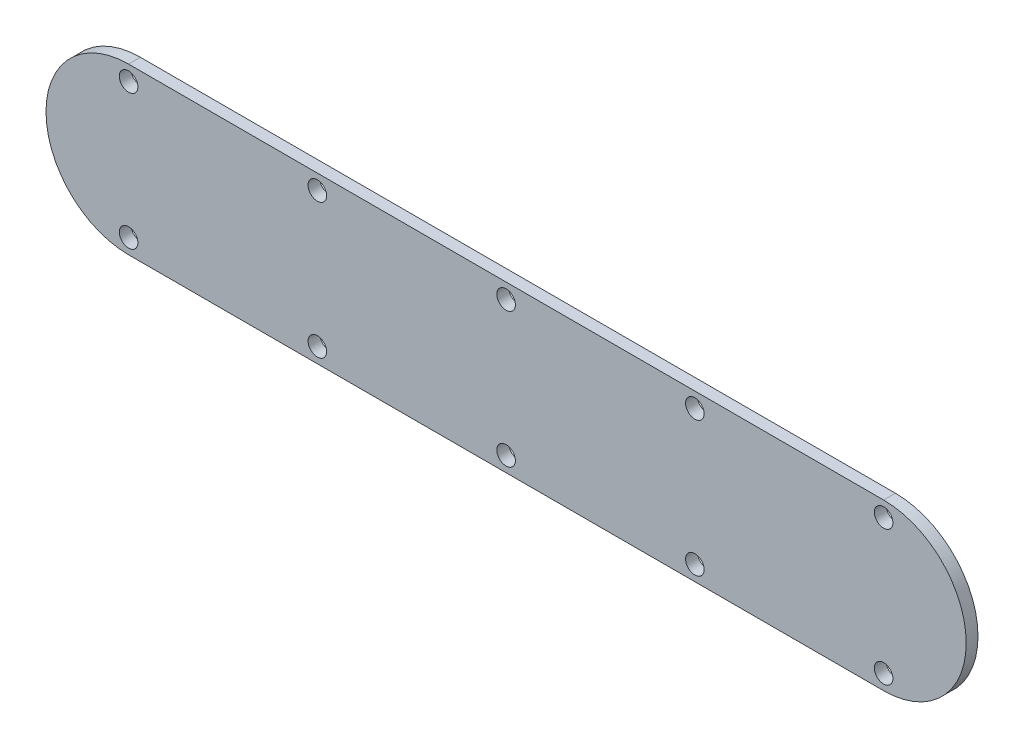
ISO-10303-21;
HEADER;
FILE_DESCRIPTION(('STEP AP214'),'2;1');
FILE_NAME('part.step','',(''),(''),'','','');
FILE_SCHEMA(('AUTOMOTIVE_DESIGN { 1 0 10303 214 1 1 1 1 }'));
ENDSEC;
DATA;
#1=APPLICATION_CONTEXT('core data for automotive mechanical design processes');
#2=APPLICATION_PROTOCOL_DEFINITION('international standard','automotive_design',2000,#1);
#3=PRODUCT_CONTEXT('',#1,'mechanical');
#4=PRODUCT('Part','Part','',(#3));
#5=PRODUCT_RELATED_PRODUCT_CATEGORY('part','',(#4));
#6=PRODUCT_DEFINITION_FORMATION('','',#4);
#7=PRODUCT_DEFINITION_CONTEXT('part definition',#1,'design');
#8=PRODUCT_DEFINITION('design','',#6,#7);
#9=PRODUCT_DEFINITION_SHAPE('','',#8);
#10=(LENGTH_UNIT() NAMED_UNIT(*) SI_UNIT(.MILLI.,.METRE.));
#11=(NAMED_UNIT(*) PLANE_ANGLE_UNIT() SI_UNIT($,.RADIAN.));
#12=(NAMED_UNIT(*) SI_UNIT($,.STERADIAN.) SOLID_ANGLE_UNIT());
#13=UNCERTAINTY_MEASURE_WITH_UNIT(LENGTH_MEASURE(1.E-05),#10,'distance_accuracy_value','');
#14=(GEOMETRIC_REPRESENTATION_CONTEXT(3) GLOBAL_UNCERTAINTY_ASSIGNED_CONTEXT((#13)) GLOBAL_UNIT_ASSIGNED_CONTEXT((#10,
#11,#12)) REPRESENTATION_CONTEXT('',''));
#15=CARTESIAN_POINT('',(0.,0.,0.));
#16=DIRECTION('',(0.,0.,1.));
#17=DIRECTION('',(1.,0.,0.));
#18=AXIS2_PLACEMENT_3D('',#15,#16,#17);
#19=CARTESIAN_POINT('',(0.,0.,3.175));
#20=DIRECTION('',(0.,0.,-1.));
#21=DIRECTION('',(-1.,0.,0.));
#22=AXIS2_PLACEMENT_3D('',#19,#20,#21);
#23=PLANE('',#22);
#24=CARTESIAN_POINT('',(-101.6,18.161,3.175));
#25=DIRECTION('',(0.,0.,1.));
#26=DIRECTION('',(1.,0.,0.));
#27=AXIS2_PLACEMENT_3D('',#24,#25,#26);
#28=CIRCLE('',#27,2.499999953);
#29=CARTESIAN_POINT('',(-99.100000047,18.161,3.175));
#30=VERTEX_POINT('',#29);
#31=EDGE_CURVE('E175',#30,#30,#28,.T.);
#32=ORIENTED_EDGE('',*,*,#31,.F.);
#33=EDGE_LOOP('',(#32));
#34=FACE_BOUND('',#33,.T.);
#35=CARTESIAN_POINT('',(-50.8,18.161,3.175));
#36=DIRECTION('',(0.,0.,1.));
#37=DIRECTION('',(1.,0.,0.));
#38=AXIS2_PLACEMENT_3D('',#35,#36,#37);
#39=CIRCLE('',#38,2.499999953);
#40=CARTESIAN_POINT('',(-48.300000047,18.161,3.175));
#41=VERTEX_POINT('',#40);
#42=EDGE_CURVE('E177',#41,#41,#39,.T.);
#43=ORIENTED_EDGE('',*,*,#42,.F.);
#44=EDGE_LOOP('',(#43));
#45=FACE_BOUND('',#44,.T.);
#46=CARTESIAN_POINT('',(0.,18.161,3.175));
#47=DIRECTION('',(0.,0.,1.));
#48=DIRECTION('',(1.,0.,0.));
#49=AXIS2_PLACEMENT_3D('',#46,#47,#48);
#50=CIRCLE('',#49,2.499999953);
#51=CARTESIAN_POINT('',(2.499999953,18.161,3.175));
#52=VERTEX_POINT('',#51);
#53=EDGE_CURVE('E185',#52,#52,#50,.T.);
#54=ORIENTED_EDGE('',*,*,#53,.F.);
#55=EDGE_LOOP('',(#54));
#56=FACE_BOUND('',#55,.T.);
#57=CARTESIAN_POINT('',(50.8,18.161,3.175));
#58=DIRECTION('',(0.,0.,1.));
#59=DIRECTION('',(1.,0.,0.));
#60=AXIS2_PLACEMENT_3D('',#57,#58,#59);
#61=CIRCLE('',#60,2.499999953);
#62=CARTESIAN_POINT('',(53.299999953,18.161,3.175));
#63=VERTEX_POINT('',#62);
#64=EDGE_CURVE('E191',#63,#63,#61,.T.);
#65=ORIENTED_EDGE('',*,*,#64,.F.);
#66=EDGE_LOOP('',(#65));
#67=FACE_BOUND('',#66,.T.);
#68=CARTESIAN_POINT('',(101.6,18.161,3.175));
#69=DIRECTION('',(0.,0.,1.));
#70=DIRECTION('',(1.,0.,0.));
#71=AXIS2_PLACEMENT_3D('',#68,#69,#70);
#72=CIRCLE('',#71,2.499999953);
#73=CARTESIAN_POINT('',(104.099999953,18.161,3.175));
#74=VERTEX_POINT('',#73);
#75=EDGE_CURVE('E197',#74,#74,#72,.T.);
#76=ORIENTED_EDGE('',*,*,#75,.F.);
#77=EDGE_LOOP('',(#76));
#78=FACE_BOUND('',#77,.T.);
#79=CARTESIAN_POINT('',(50.8,-18.161,3.175));
#80=DIRECTION('',(0.,0.,1.));
#81=DIRECTION('',(1.,0.,0.));
#82=AXIS2_PLACEMENT_3D('',#79,#80,#81);
#83=CIRCLE('',#82,2.499999953);
#84=CARTESIAN_POINT('',(53.299999953,-18.161,3.175));
#85=VERTEX_POINT('',#84);
#86=EDGE_CURVE('E209',#85,#85,#83,.T.);
#87=ORIENTED_EDGE('',*,*,#86,.F.);
#88=EDGE_LOOP('',(#87));
#89=FACE_BOUND('',#88,.T.);
#90=CARTESIAN_POINT('',(0.,-18.161,3.175));
#91=DIRECTION('',(0.,0.,1.));
#92=DIRECTION('',(1.,0.,0.));
#93=AXIS2_PLACEMENT_3D('',#90,#91,#92);
#94=CIRCLE('',#93,2.499999953);
#95=CARTESIAN_POINT('',(2.499999953,-18.161,3.175));
#96=VERTEX_POINT('',#95);
#97=EDGE_CURVE('E215',#96,#96,#94,.T.);
#98=ORIENTED_EDGE('',*,*,#97,.F.);
#99=EDGE_LOOP('',(#98));
#100=FACE_BOUND('',#99,.T.);
#101=CARTESIAN_POINT('',(-101.6,-18.161,3.175));
#102=DIRECTION('',(0.,0.,1.));
#103=DIRECTION('',(1.,0.,0.));
#104=AXIS2_PLACEMENT_3D('',#101,#102,#103);
#105=CIRCLE('',#104,2.499999953);
#106=CARTESIAN_POINT('',(-99.100000047,-18.161,3.175));
#107=VERTEX_POINT('',#106);
#108=EDGE_CURVE('E227',#107,#107,#105,.T.);
#109=ORIENTED_EDGE('',*,*,#108,.F.);
#110=EDGE_LOOP('',(#109));
#111=FACE_BOUND('',#110,.T.);
#112=CARTESIAN_POINT('',(-101.6,0.,3.175));
#113=DIRECTION('',(0.,0.,1.));
#114=DIRECTION('',(1.,0.,0.));
#115=AXIS2_PLACEMENT_3D('',#112,#113,#114);
#116=CIRCLE('',#115,22.225);
#117=CARTESIAN_POINT('',(-101.6,22.225,3.175));
#118=VERTEX_POINT('',#117);
#119=CARTESIAN_POINT('',(-101.6,-22.225,3.175));
#120=VERTEX_POINT('',#119);
#121=EDGE_CURVE('E55',#118,#120,#116,.T.);
#122=ORIENTED_EDGE('',*,*,#121,.T.);
#123=DIRECTION('',(1.,0.,0.));
#124=VECTOR('',#123,1.);
#125=CARTESIAN_POINT('',(123.825,-22.225,3.175));
#126=LINE('',#125,#124);
#127=CARTESIAN_POINT('',(101.6,-22.225,3.175));
#128=VERTEX_POINT('',#127);
#129=EDGE_CURVE('E41',#120,#128,#126,.T.);
#130=ORIENTED_EDGE('',*,*,#129,.T.);
#131=CARTESIAN_POINT('',(101.6,0.,3.175));
#132=DIRECTION('',(0.,0.,1.));
#133=DIRECTION('',(1.,0.,0.));
#134=AXIS2_PLACEMENT_3D('',#131,#132,#133);
#135=CIRCLE('',#134,22.225);
#136=CARTESIAN_POINT('',(101.6,22.225,3.175));
#137=VERTEX_POINT('',#136);
#138=EDGE_CURVE('E81',#128,#137,#135,.T.);
#139=ORIENTED_EDGE('',*,*,#138,.T.);
#140=DIRECTION('',(-1.,0.,0.));
#141=VECTOR('',#140,1.);
#142=CARTESIAN_POINT('',(123.825,22.225,3.175));
#143=LINE('',#142,#141);
#144=EDGE_CURVE('E11',#137,#118,#143,.T.);
#145=ORIENTED_EDGE('',*,*,#144,.T.);
#146=EDGE_LOOP('',(#122,#130,#139,#145));
#147=FACE_BOUND('',#146,.T.);
#148=CARTESIAN_POINT('',(-50.8,-18.161,3.175));
#149=DIRECTION('',(0.,0.,1.));
#150=DIRECTION('',(1.,0.,0.));
#151=AXIS2_PLACEMENT_3D('',#148,#149,#150);
#152=CIRCLE('',#151,2.499999953);
#153=CARTESIAN_POINT('',(-48.300000047,-18.161,3.175));
#154=VERTEX_POINT('',#153);
#155=EDGE_CURVE('E221',#154,#154,#152,.T.);
#156=ORIENTED_EDGE('',*,*,#155,.F.);
#157=EDGE_LOOP('',(#156));
#158=FACE_BOUND('',#157,.T.);
#159=CARTESIAN_POINT('',(101.6,-18.161,3.175));
#160=DIRECTION('',(0.,0.,1.));
#161=DIRECTION('',(1.,0.,0.));
#162=AXIS2_PLACEMENT_3D('',#159,#160,#161);
#163=CIRCLE('',#162,2.499999953);
#164=CARTESIAN_POINT('',(104.099999953,-18.161,3.175));
#165=VERTEX_POINT('',#164);
#166=EDGE_CURVE('E203',#165,#165,#163,.T.);
#167=ORIENTED_EDGE('',*,*,#166,.F.);
#168=EDGE_LOOP('',(#167));
#169=FACE_BOUND('',#168,.T.);
#170=ADVANCED_FACE('F32',(#34,#45,#56,#67,#78,#89,#100,#111,#147,#158,#169),#23,.F.);
#171=CARTESIAN_POINT('',(0.,0.,0.));
#172=DIRECTION('',(0.,0.,-1.));
#173=DIRECTION('',(-1.,0.,0.));
#174=AXIS2_PLACEMENT_3D('',#171,#172,#173);
#175=PLANE('',#174);
#176=CARTESIAN_POINT('',(-101.6,18.161,0.));
#177=DIRECTION('',(0.,0.,1.));
#178=DIRECTION('',(1.,0.,0.));
#179=AXIS2_PLACEMENT_3D('',#176,#177,#178);
#180=CIRCLE('',#179,2.499999953);
#181=CARTESIAN_POINT('',(-99.100000047,18.161,0.));
#182=VERTEX_POINT('',#181);
#183=EDGE_CURVE('E172',#182,#182,#180,.T.);
#184=ORIENTED_EDGE('',*,*,#183,.T.);
#185=EDGE_LOOP('',(#184));
#186=FACE_BOUND('',#185,.T.);
#187=CARTESIAN_POINT('',(-50.8,18.161,0.));
#188=DIRECTION('',(0.,0.,1.));
#189=DIRECTION('',(1.,0.,0.));
#190=AXIS2_PLACEMENT_3D('',#187,#188,#189);
#191=CIRCLE('',#190,2.499999953);
#192=CARTESIAN_POINT('',(-48.300000047,18.161,0.));
#193=VERTEX_POINT('',#192);
#194=EDGE_CURVE('E182',#193,#193,#191,.T.);
#195=ORIENTED_EDGE('',*,*,#194,.T.);
#196=EDGE_LOOP('',(#195));
#197=FACE_BOUND('',#196,.T.);
#198=CARTESIAN_POINT('',(0.,18.161,0.));
#199=DIRECTION('',(0.,0.,1.));
#200=DIRECTION('',(1.,0.,0.));
#201=AXIS2_PLACEMENT_3D('',#198,#199,#200);
#202=CIRCLE('',#201,2.499999953);
#203=CARTESIAN_POINT('',(2.499999953,18.161,0.));
#204=VERTEX_POINT('',#203);
#205=EDGE_CURVE('E188',#204,#204,#202,.T.);
#206=ORIENTED_EDGE('',*,*,#205,.T.);
#207=EDGE_LOOP('',(#206));
#208=FACE_BOUND('',#207,.T.);
#209=CARTESIAN_POINT('',(50.8,18.161,0.));
#210=DIRECTION('',(0.,0.,1.));
#211=DIRECTION('',(1.,0.,0.));
#212=AXIS2_PLACEMENT_3D('',#209,#210,#211);
#213=CIRCLE('',#212,2.499999953);
#214=CARTESIAN_POINT('',(53.299999953,18.161,0.));
#215=VERTEX_POINT('',#214);
#216=EDGE_CURVE('E194',#215,#215,#213,.T.);
#217=ORIENTED_EDGE('',*,*,#216,.T.);
#218=EDGE_LOOP('',(#217));
#219=FACE_BOUND('',#218,.T.);
#220=CARTESIAN_POINT('',(101.6,18.161,0.));
#221=DIRECTION('',(0.,0.,1.));
#222=DIRECTION('',(1.,0.,0.));
#223=AXIS2_PLACEMENT_3D('',#220,#221,#222);
#224=CIRCLE('',#223,2.499999953);
#225=CARTESIAN_POINT('',(104.099999953,18.161,0.));
#226=VERTEX_POINT('',#225);
#227=EDGE_CURVE('E200',#226,#226,#224,.T.);
#228=ORIENTED_EDGE('',*,*,#227,.T.);
#229=EDGE_LOOP('',(#228));
#230=FACE_BOUND('',#229,.T.);
#231=CARTESIAN_POINT('',(101.6,-18.161,0.));
#232=DIRECTION('',(0.,0.,1.));
#233=DIRECTION('',(1.,0.,0.));
#234=AXIS2_PLACEMENT_3D('',#231,#232,#233);
#235=CIRCLE('',#234,2.499999953);
#236=CARTESIAN_POINT('',(104.099999953,-18.161,0.));
#237=VERTEX_POINT('',#236);
#238=EDGE_CURVE('E206',#237,#237,#235,.T.);
#239=ORIENTED_EDGE('',*,*,#238,.T.);
#240=EDGE_LOOP('',(#239));
#241=FACE_BOUND('',#240,.T.);
#242=CARTESIAN_POINT('',(50.8,-18.161,0.));
#243=DIRECTION('',(0.,0.,1.));
#244=DIRECTION('',(1.,0.,0.));
#245=AXIS2_PLACEMENT_3D('',#242,#243,#244);
#246=CIRCLE('',#245,2.499999953);
#247=CARTESIAN_POINT('',(53.299999953,-18.161,0.));
#248=VERTEX_POINT('',#247);
#249=EDGE_CURVE('E212',#248,#248,#246,.T.);
#250=ORIENTED_EDGE('',*,*,#249,.T.);
#251=EDGE_LOOP('',(#250));
#252=FACE_BOUND('',#251,.T.);
#253=CARTESIAN_POINT('',(0.,-18.161,0.));
#254=DIRECTION('',(0.,0.,1.));
#255=DIRECTION('',(1.,0.,0.));
#256=AXIS2_PLACEMENT_3D('',#253,#254,#255);
#257=CIRCLE('',#256,2.499999953);
#258=CARTESIAN_POINT('',(2.499999953,-18.161,0.));
#259=VERTEX_POINT('',#258);
#260=EDGE_CURVE('E218',#259,#259,#257,.T.);
#261=ORIENTED_EDGE('',*,*,#260,.T.);
#262=EDGE_LOOP('',(#261));
#263=FACE_BOUND('',#262,.T.);
#264=CARTESIAN_POINT('',(-50.8,-18.161,0.));
#265=DIRECTION('',(0.,0.,1.));
#266=DIRECTION('',(1.,0.,0.));
#267=AXIS2_PLACEMENT_3D('',#264,#265,#266);
#268=CIRCLE('',#267,2.499999953);
#269=CARTESIAN_POINT('',(-48.300000047,-18.161,0.));
#270=VERTEX_POINT('',#269);
#271=EDGE_CURVE('E224',#270,#270,#268,.T.);
#272=ORIENTED_EDGE('',*,*,#271,.T.);
#273=EDGE_LOOP('',(#272));
#274=FACE_BOUND('',#273,.T.);
#275=CARTESIAN_POINT('',(-101.6,-18.161,0.));
#276=DIRECTION('',(0.,0.,1.));
#277=DIRECTION('',(1.,0.,0.));
#278=AXIS2_PLACEMENT_3D('',#275,#276,#277);
#279=CIRCLE('',#278,2.499999953);
#280=CARTESIAN_POINT('',(-99.100000047,-18.161,0.));
#281=VERTEX_POINT('',#280);
#282=EDGE_CURVE('E94',#281,#281,#279,.T.);
#283=ORIENTED_EDGE('',*,*,#282,.T.);
#284=EDGE_LOOP('',(#283));
#285=FACE_BOUND('',#284,.T.);
#286=DIRECTION('',(1.,0.,0.));
#287=VECTOR('',#286,1.);
#288=CARTESIAN_POINT('',(123.825,-22.225,0.));
#289=LINE('',#288,#287);
#290=CARTESIAN_POINT('',(-101.6,-22.225,0.));
#291=VERTEX_POINT('',#290);
#292=CARTESIAN_POINT('',(101.6,-22.225,0.));
#293=VERTEX_POINT('',#292);
#294=EDGE_CURVE('E93',#291,#293,#289,.T.);
#295=ORIENTED_EDGE('',*,*,#294,.F.);
#296=CARTESIAN_POINT('',(-101.6,0.,0.));
#297=DIRECTION('',(0.,0.,1.));
#298=DIRECTION('',(1.,0.,0.));
#299=AXIS2_PLACEMENT_3D('',#296,#297,#298);
#300=CIRCLE('',#299,22.225);
#301=CARTESIAN_POINT('',(-101.6,22.225,0.));
#302=VERTEX_POINT('',#301);
#303=EDGE_CURVE('E71',#302,#291,#300,.T.);
#304=ORIENTED_EDGE('',*,*,#303,.F.);
#305=DIRECTION('',(-1.,0.,0.));
#306=VECTOR('',#305,1.);
#307=CARTESIAN_POINT('',(123.825,22.225,0.));
#308=LINE('',#307,#306);
#309=CARTESIAN_POINT('',(101.6,22.225,0.));
#310=VERTEX_POINT('',#309);
#311=EDGE_CURVE('E36',#310,#302,#308,.T.);
#312=ORIENTED_EDGE('',*,*,#311,.F.);
#313=CARTESIAN_POINT('',(101.6,0.,0.));
#314=DIRECTION('',(0.,0.,1.));
#315=DIRECTION('',(1.,0.,0.));
#316=AXIS2_PLACEMENT_3D('',#313,#314,#315);
#317=CIRCLE('',#316,22.225);
#318=EDGE_CURVE('E79',#293,#310,#317,.T.);
#319=ORIENTED_EDGE('',*,*,#318,.F.);
#320=EDGE_LOOP('',(#295,#304,#312,#319));
#321=FACE_BOUND('',#320,.T.);
#322=ADVANCED_FACE('F106',(#186,#197,#208,#219,#230,#241,#252,#263,#274,#285,#321),#175,.T.);
#323=CARTESIAN_POINT('',(123.825,-22.225,3.175));
#324=DIRECTION('',(0.,1.,0.));
#325=DIRECTION('',(-1.,0.,0.));
#326=AXIS2_PLACEMENT_3D('',#323,#324,#325);
#327=PLANE('',#326);
#328=DIRECTION('',(0.,0.,1.));
#329=VECTOR('',#328,1.);
#330=CARTESIAN_POINT('',(-101.6,-22.225,0.));
#331=LINE('',#330,#329);
#332=EDGE_CURVE('E89',#291,#120,#331,.T.);
#333=ORIENTED_EDGE('',*,*,#332,.F.);
#334=ORIENTED_EDGE('',*,*,#294,.T.);
#335=DIRECTION('',(0.,0.,1.));
#336=VECTOR('',#335,1.);
#337=CARTESIAN_POINT('',(101.6,-22.225,0.));
#338=LINE('',#337,#336);
#339=EDGE_CURVE('E84',#293,#128,#338,.T.);
#340=ORIENTED_EDGE('',*,*,#339,.T.);
#341=ORIENTED_EDGE('',*,*,#129,.F.);
#342=EDGE_LOOP('',(#333,#334,#340,#341));
#343=FACE_BOUND('',#342,.T.);
#344=ADVANCED_FACE('F34',(#343),#327,.F.);
#345=CARTESIAN_POINT('',(123.825,22.225,3.175));
#346=DIRECTION('',(0.,-1.,0.));
#347=DIRECTION('',(1.,0.,0.));
#348=AXIS2_PLACEMENT_3D('',#345,#346,#347);
#349=PLANE('',#348);
#350=ORIENTED_EDGE('',*,*,#311,.T.);
#351=DIRECTION('',(0.,0.,1.));
#352=VECTOR('',#351,1.);
#353=CARTESIAN_POINT('',(-101.6,22.225,0.));
#354=LINE('',#353,#352);
#355=EDGE_CURVE('E49',#302,#118,#354,.T.);
#356=ORIENTED_EDGE('',*,*,#355,.T.);
#357=ORIENTED_EDGE('',*,*,#144,.F.);
#358=DIRECTION('',(0.,0.,1.));
#359=VECTOR('',#358,1.);
#360=CARTESIAN_POINT('',(101.6,22.225,0.));
#361=LINE('',#360,#359);
#362=EDGE_CURVE('E67',#310,#137,#361,.T.);
#363=ORIENTED_EDGE('',*,*,#362,.F.);
#364=EDGE_LOOP('',(#350,#356,#357,#363));
#365=FACE_BOUND('',#364,.T.);
#366=ADVANCED_FACE('F105',(#365),#349,.F.);
#367=CARTESIAN_POINT('',(101.6,0.,0.));
#368=DIRECTION('',(0.,0.,1.));
#369=DIRECTION('',(1.,0.,0.));
#370=AXIS2_PLACEMENT_3D('',#367,#368,#369);
#371=CYLINDRICAL_SURFACE('',#370,22.225);
#372=ORIENTED_EDGE('',*,*,#138,.F.);
#373=ORIENTED_EDGE('',*,*,#339,.F.);
#374=ORIENTED_EDGE('',*,*,#318,.T.);
#375=ORIENTED_EDGE('',*,*,#362,.T.);
#376=EDGE_LOOP('',(#372,#373,#374,#375));
#377=FACE_BOUND('',#376,.T.);
#378=ADVANCED_FACE('F83',(#377),#371,.T.);
#379=CARTESIAN_POINT('',(-101.6,0.,0.));
#380=DIRECTION('',(0.,0.,1.));
#381=DIRECTION('',(1.,0.,0.));
#382=AXIS2_PLACEMENT_3D('',#379,#380,#381);
#383=CYLINDRICAL_SURFACE('',#382,22.225);
#384=ORIENTED_EDGE('',*,*,#121,.F.);
#385=ORIENTED_EDGE('',*,*,#355,.F.);
#386=ORIENTED_EDGE('',*,*,#303,.T.);
#387=ORIENTED_EDGE('',*,*,#332,.T.);
#388=EDGE_LOOP('',(#384,#385,#386,#387));
#389=FACE_BOUND('',#388,.T.);
#390=ADVANCED_FACE('F123',(#389),#383,.T.);
#391=CARTESIAN_POINT('',(-101.6,-18.161,3.175));
#392=DIRECTION('',(0.,0.,1.));
#393=DIRECTION('',(1.,0.,0.));
#394=AXIS2_PLACEMENT_3D('',#391,#392,#393);
#395=CYLINDRICAL_SURFACE('',#394,2.499999953);
#396=ORIENTED_EDGE('',*,*,#282,.F.);
#397=EDGE_LOOP('',(#396));
#398=FACE_BOUND('',#397,.T.);
#399=ORIENTED_EDGE('',*,*,#108,.T.);
#400=EDGE_LOOP('',(#399));
#401=FACE_BOUND('',#400,.T.);
#402=ADVANCED_FACE('F127',(#398,#401),#395,.F.);
#403=CARTESIAN_POINT('',(-50.8,-18.161,3.175));
#404=DIRECTION('',(0.,0.,1.));
#405=DIRECTION('',(1.,0.,0.));
#406=AXIS2_PLACEMENT_3D('',#403,#404,#405);
#407=CYLINDRICAL_SURFACE('',#406,2.499999953);
#408=ORIENTED_EDGE('',*,*,#271,.F.);
#409=EDGE_LOOP('',(#408));
#410=FACE_BOUND('',#409,.T.);
#411=ORIENTED_EDGE('',*,*,#155,.T.);
#412=EDGE_LOOP('',(#411));
#413=FACE_BOUND('',#412,.T.);
#414=ADVANCED_FACE('F132',(#410,#413),#407,.F.);
#415=CARTESIAN_POINT('',(0.,-18.161,3.175));
#416=DIRECTION('',(0.,0.,1.));
#417=DIRECTION('',(1.,0.,0.));
#418=AXIS2_PLACEMENT_3D('',#415,#416,#417);
#419=CYLINDRICAL_SURFACE('',#418,2.499999953);
#420=ORIENTED_EDGE('',*,*,#260,.F.);
#421=EDGE_LOOP('',(#420));
#422=FACE_BOUND('',#421,.T.);
#423=ORIENTED_EDGE('',*,*,#97,.T.);
#424=EDGE_LOOP('',(#423));
#425=FACE_BOUND('',#424,.T.);
#426=ADVANCED_FACE('F136',(#422,#425),#419,.F.);
#427=CARTESIAN_POINT('',(50.8,-18.161,3.175));
#428=DIRECTION('',(0.,0.,1.));
#429=DIRECTION('',(1.,0.,0.));
#430=AXIS2_PLACEMENT_3D('',#427,#428,#429);
#431=CYLINDRICAL_SURFACE('',#430,2.499999953);
#432=ORIENTED_EDGE('',*,*,#249,.F.);
#433=EDGE_LOOP('',(#432));
#434=FACE_BOUND('',#433,.T.);
#435=ORIENTED_EDGE('',*,*,#86,.T.);
#436=EDGE_LOOP('',(#435));
#437=FACE_BOUND('',#436,.T.);
#438=ADVANCED_FACE('F140',(#434,#437),#431,.F.);
#439=CARTESIAN_POINT('',(101.6,-18.161,3.175));
#440=DIRECTION('',(0.,0.,1.));
#441=DIRECTION('',(1.,0.,0.));
#442=AXIS2_PLACEMENT_3D('',#439,#440,#441);
#443=CYLINDRICAL_SURFACE('',#442,2.499999953);
#444=ORIENTED_EDGE('',*,*,#238,.F.);
#445=EDGE_LOOP('',(#444));
#446=FACE_BOUND('',#445,.T.);
#447=ORIENTED_EDGE('',*,*,#166,.T.);
#448=EDGE_LOOP('',(#447));
#449=FACE_BOUND('',#448,.T.);
#450=ADVANCED_FACE('F144',(#446,#449),#443,.F.);
#451=CARTESIAN_POINT('',(101.6,18.161,3.175));
#452=DIRECTION('',(0.,0.,1.));
#453=DIRECTION('',(1.,0.,0.));
#454=AXIS2_PLACEMENT_3D('',#451,#452,#453);
#455=CYLINDRICAL_SURFACE('',#454,2.499999953);
#456=ORIENTED_EDGE('',*,*,#227,.F.);
#457=EDGE_LOOP('',(#456));
#458=FACE_BOUND('',#457,.T.);
#459=ORIENTED_EDGE('',*,*,#75,.T.);
#460=EDGE_LOOP('',(#459));
#461=FACE_BOUND('',#460,.T.);
#462=ADVANCED_FACE('F148',(#458,#461),#455,.F.);
#463=CARTESIAN_POINT('',(50.8,18.161,3.175));
#464=DIRECTION('',(0.,0.,1.));
#465=DIRECTION('',(1.,0.,0.));
#466=AXIS2_PLACEMENT_3D('',#463,#464,#465);
#467=CYLINDRICAL_SURFACE('',#466,2.499999953);
#468=ORIENTED_EDGE('',*,*,#216,.F.);
#469=EDGE_LOOP('',(#468));
#470=FACE_BOUND('',#469,.T.);
#471=ORIENTED_EDGE('',*,*,#64,.T.);
#472=EDGE_LOOP('',(#471));
#473=FACE_BOUND('',#472,.T.);
#474=ADVANCED_FACE('F152',(#470,#473),#467,.F.);
#475=CARTESIAN_POINT('',(0.,18.161,3.175));
#476=DIRECTION('',(0.,0.,1.));
#477=DIRECTION('',(1.,0.,0.));
#478=AXIS2_PLACEMENT_3D('',#475,#476,#477);
#479=CYLINDRICAL_SURFACE('',#478,2.499999953);
#480=ORIENTED_EDGE('',*,*,#205,.F.);
#481=EDGE_LOOP('',(#480));
#482=FACE_BOUND('',#481,.T.);
#483=ORIENTED_EDGE('',*,*,#53,.T.);
#484=EDGE_LOOP('',(#483));
#485=FACE_BOUND('',#484,.T.);
#486=ADVANCED_FACE('F156',(#482,#485),#479,.F.);
#487=CARTESIAN_POINT('',(-50.8,18.161,3.175));
#488=DIRECTION('',(0.,0.,1.));
#489=DIRECTION('',(1.,0.,0.));
#490=AXIS2_PLACEMENT_3D('',#487,#488,#489);
#491=CYLINDRICAL_SURFACE('',#490,2.499999953);
#492=ORIENTED_EDGE('',*,*,#194,.F.);
#493=EDGE_LOOP('',(#492));
#494=FACE_BOUND('',#493,.T.);
#495=ORIENTED_EDGE('',*,*,#42,.T.);
#496=EDGE_LOOP('',(#495));
#497=FACE_BOUND('',#496,.T.);
#498=ADVANCED_FACE('F160',(#494,#497),#491,.F.);
#499=CARTESIAN_POINT('',(-101.6,18.161,3.175));
#500=DIRECTION('',(0.,0.,1.));
#501=DIRECTION('',(1.,0.,0.));
#502=AXIS2_PLACEMENT_3D('',#499,#500,#501);
#503=CYLINDRICAL_SURFACE('',#502,2.499999953);
#504=ORIENTED_EDGE('',*,*,#183,.F.);
#505=EDGE_LOOP('',(#504));
#506=FACE_BOUND('',#505,.T.);
#507=ORIENTED_EDGE('',*,*,#31,.T.);
#508=EDGE_LOOP('',(#507));
#509=FACE_BOUND('',#508,.T.);
#510=ADVANCED_FACE('F164',(#506,#509),#503,.F.);
#511=CLOSED_SHELL('',(#170,#322,#344,#366,#378,#390,#402,#414,#426,#438,#450,#462,#474,#486,
#498,#510));
#512=MANIFOLD_SOLID_BREP('B2',#511);
#513=ADVANCED_BREP_SHAPE_REPRESENTATION('',(#18,#512),#14);
#514=SHAPE_DEFINITION_REPRESENTATION(#9,#513);
ENDSEC;
END-ISO-10303-21;
